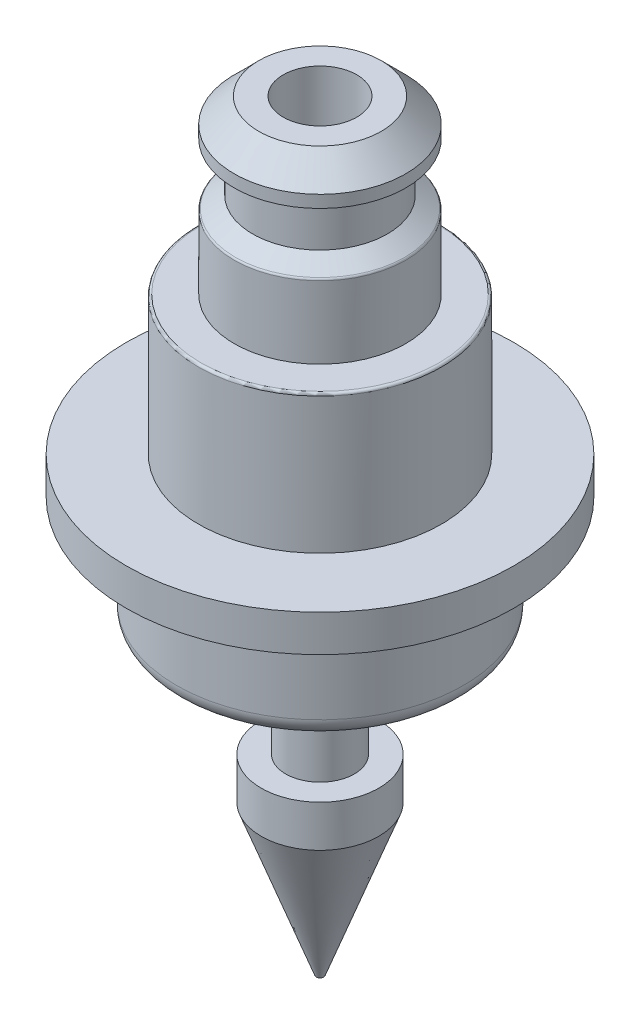
ISO-10303-21;
HEADER;
FILE_DESCRIPTION(('STEP AP214'),'2;1');
FILE_NAME('part.step','',(''),(''),'','','');
FILE_SCHEMA(('AUTOMOTIVE_DESIGN { 1 0 10303 214 1 1 1 1 }'));
ENDSEC;
DATA;
#1=APPLICATION_CONTEXT('core data for automotive mechanical design processes');
#2=APPLICATION_PROTOCOL_DEFINITION('international standard','automotive_design',2000,#1);
#3=PRODUCT_CONTEXT('',#1,'mechanical');
#4=PRODUCT('Part','Part','',(#3));
#5=PRODUCT_RELATED_PRODUCT_CATEGORY('part','',(#4));
#6=PRODUCT_DEFINITION_FORMATION('','',#4);
#7=PRODUCT_DEFINITION_CONTEXT('part definition',#1,'design');
#8=PRODUCT_DEFINITION('design','',#6,#7);
#9=PRODUCT_DEFINITION_SHAPE('','',#8);
#10=(LENGTH_UNIT() NAMED_UNIT(*) SI_UNIT(.MILLI.,.METRE.));
#11=(NAMED_UNIT(*) PLANE_ANGLE_UNIT() SI_UNIT($,.RADIAN.));
#12=(NAMED_UNIT(*) SI_UNIT($,.STERADIAN.) SOLID_ANGLE_UNIT());
#13=UNCERTAINTY_MEASURE_WITH_UNIT(LENGTH_MEASURE(1.E-05),#10,'distance_accuracy_value','');
#14=(GEOMETRIC_REPRESENTATION_CONTEXT(3) GLOBAL_UNCERTAINTY_ASSIGNED_CONTEXT((#13)) GLOBAL_UNIT_ASSIGNED_CONTEXT((#10,
#11,#12)) REPRESENTATION_CONTEXT('',''));
#15=CARTESIAN_POINT('',(0.,0.,0.));
#16=DIRECTION('',(0.,0.,1.));
#17=DIRECTION('',(1.,0.,0.));
#18=AXIS2_PLACEMENT_3D('',#15,#16,#17);
#19=CARTESIAN_POINT('',(0.,0.,0.));
#20=DIRECTION('',(0.,-1.,0.));
#21=DIRECTION('',(0.,0.,-1.));
#22=AXIS2_PLACEMENT_3D('',#19,#20,#21);
#23=CYLINDRICAL_SURFACE('',#22,1.5);
#24=CARTESIAN_POINT('',(0.,0.,0.));
#25=DIRECTION('',(0.,-1.,0.));
#26=DIRECTION('',(0.,0.,-1.));
#27=AXIS2_PLACEMENT_3D('',#24,#25,#26);
#28=CIRCLE('',#27,1.5);
#29=CARTESIAN_POINT('',(0.,0.,-1.5));
#30=VERTEX_POINT('',#29);
#31=EDGE_CURVE('E112',#30,#30,#28,.T.);
#32=ORIENTED_EDGE('',*,*,#31,.T.);
#33=EDGE_LOOP('',(#32));
#34=FACE_BOUND('',#33,.T.);
#35=CARTESIAN_POINT('',(0.,14.15,0.));
#36=DIRECTION('',(0.,-1.,0.));
#37=DIRECTION('',(0.,0.,-1.));
#38=AXIS2_PLACEMENT_3D('',#35,#36,#37);
#39=CIRCLE('',#38,1.5);
#40=CARTESIAN_POINT('',(0.,14.15,-1.5));
#41=VERTEX_POINT('',#40);
#42=EDGE_CURVE('E61',#41,#41,#39,.T.);
#43=ORIENTED_EDGE('',*,*,#42,.F.);
#44=EDGE_LOOP('',(#43));
#45=FACE_BOUND('',#44,.T.);
#46=ADVANCED_FACE('F35',(#34,#45),#23,.F.);
#47=CARTESIAN_POINT('',(1.5,14.15,0.));
#48=DIRECTION('',(0.,1.,0.));
#49=DIRECTION('',(0.,0.,1.));
#50=AXIS2_PLACEMENT_3D('',#47,#48,#49);
#51=PLANE('',#50);
#52=ORIENTED_EDGE('',*,*,#42,.T.);
#53=EDGE_LOOP('',(#52));
#54=FACE_BOUND('',#53,.T.);
#55=CARTESIAN_POINT('',(0.,14.15,0.));
#56=DIRECTION('',(0.,-1.,0.));
#57=DIRECTION('',(0.,0.,-1.));
#58=AXIS2_PLACEMENT_3D('',#55,#56,#57);
#59=CIRCLE('',#58,2.5);
#60=CARTESIAN_POINT('',(0.,14.15,-2.5));
#61=VERTEX_POINT('',#60);
#62=EDGE_CURVE('E64',#61,#61,#59,.T.);
#63=ORIENTED_EDGE('',*,*,#62,.F.);
#64=EDGE_LOOP('',(#63));
#65=FACE_BOUND('',#64,.T.);
#66=ADVANCED_FACE('F135',(#54,#65),#51,.T.);
#67=CARTESIAN_POINT('',(0.,13.15,0.));
#68=DIRECTION('',(0.,-1.,0.));
#69=DIRECTION('',(0.,0.,-1.));
#70=AXIS2_PLACEMENT_3D('',#67,#68,#69);
#71=CONICAL_SURFACE('',#70,3.5,0.785398163397448);
#72=ORIENTED_EDGE('',*,*,#62,.T.);
#73=EDGE_LOOP('',(#72));
#74=FACE_BOUND('',#73,.T.);
#75=CARTESIAN_POINT('',(0.,13.15,0.));
#76=DIRECTION('',(0.,-1.,0.));
#77=DIRECTION('',(0.,0.,-1.));
#78=AXIS2_PLACEMENT_3D('',#75,#76,#77);
#79=CIRCLE('',#78,3.5);
#80=CARTESIAN_POINT('',(0.,13.15,-3.5));
#81=VERTEX_POINT('',#80);
#82=EDGE_CURVE('E67',#81,#81,#79,.T.);
#83=ORIENTED_EDGE('',*,*,#82,.F.);
#84=EDGE_LOOP('',(#83));
#85=FACE_BOUND('',#84,.T.);
#86=ADVANCED_FACE('F140',(#74,#85),#71,.T.);
#87=CARTESIAN_POINT('',(0.,0.,0.));
#88=DIRECTION('',(0.,-1.,0.));
#89=DIRECTION('',(0.,0.,-1.));
#90=AXIS2_PLACEMENT_3D('',#87,#88,#89);
#91=CYLINDRICAL_SURFACE('',#90,3.5);
#92=ORIENTED_EDGE('',*,*,#82,.T.);
#93=EDGE_LOOP('',(#92));
#94=FACE_BOUND('',#93,.T.);
#95=CARTESIAN_POINT('',(0.,12.65,0.));
#96=DIRECTION('',(0.,-1.,0.));
#97=DIRECTION('',(0.,0.,-1.));
#98=AXIS2_PLACEMENT_3D('',#95,#96,#97);
#99=CIRCLE('',#98,3.5);
#100=CARTESIAN_POINT('',(0.,12.65,-3.5));
#101=VERTEX_POINT('',#100);
#102=EDGE_CURVE('E70',#101,#101,#99,.T.);
#103=ORIENTED_EDGE('',*,*,#102,.F.);
#104=EDGE_LOOP('',(#103));
#105=FACE_BOUND('',#104,.T.);
#106=ADVANCED_FACE('F182',(#94,#105),#91,.T.);
#107=CARTESIAN_POINT('',(0.,12.15,0.));
#108=DIRECTION('',(0.,1.,0.));
#109=DIRECTION('',(0.,0.,1.));
#110=AXIS2_PLACEMENT_3D('',#107,#108,#109);
#111=CONICAL_SURFACE('',#110,2.75,0.982793723247329);
#112=ORIENTED_EDGE('',*,*,#102,.T.);
#113=EDGE_LOOP('',(#112));
#114=FACE_BOUND('',#113,.T.);
#115=CARTESIAN_POINT('',(0.,12.15,0.));
#116=DIRECTION('',(0.,-1.,0.));
#117=DIRECTION('',(0.,0.,-1.));
#118=AXIS2_PLACEMENT_3D('',#115,#116,#117);
#119=CIRCLE('',#118,2.75);
#120=CARTESIAN_POINT('',(0.,12.15,-2.75));
#121=VERTEX_POINT('',#120);
#122=EDGE_CURVE('E73',#121,#121,#119,.T.);
#123=ORIENTED_EDGE('',*,*,#122,.F.);
#124=EDGE_LOOP('',(#123));
#125=FACE_BOUND('',#124,.T.);
#126=ADVANCED_FACE('F178',(#114,#125),#111,.T.);
#127=CARTESIAN_POINT('',(0.,0.,0.));
#128=DIRECTION('',(0.,-1.,0.));
#129=DIRECTION('',(0.,0.,-1.));
#130=AXIS2_PLACEMENT_3D('',#127,#128,#129);
#131=CYLINDRICAL_SURFACE('',#130,2.75);
#132=ORIENTED_EDGE('',*,*,#122,.T.);
#133=EDGE_LOOP('',(#132));
#134=FACE_BOUND('',#133,.T.);
#135=CARTESIAN_POINT('',(0.,10.65,0.));
#136=DIRECTION('',(0.,-1.,0.));
#137=DIRECTION('',(0.,0.,-1.));
#138=AXIS2_PLACEMENT_3D('',#135,#136,#137);
#139=CIRCLE('',#138,2.75);
#140=CARTESIAN_POINT('',(0.,10.65,-2.75));
#141=VERTEX_POINT('',#140);
#142=EDGE_CURVE('E76',#141,#141,#139,.T.);
#143=ORIENTED_EDGE('',*,*,#142,.F.);
#144=EDGE_LOOP('',(#143));
#145=FACE_BOUND('',#144,.T.);
#146=ADVANCED_FACE('F174',(#134,#145),#131,.T.);
#147=CARTESIAN_POINT('',(0.,10.15,0.));
#148=DIRECTION('',(0.,-1.,0.));
#149=DIRECTION('',(0.,0.,-1.));
#150=AXIS2_PLACEMENT_3D('',#147,#148,#149);
#151=CONICAL_SURFACE('',#150,3.5,0.982793723247328);
#152=CARTESIAN_POINT('',(0.,10.179686653585,0.));
#153=DIRECTION('',(0.,1.,0.));
#154=DIRECTION('',(0.,0.,1.));
#155=AXIS2_PLACEMENT_3D('',#152,#153,#154);
#156=CIRCLE('',#155,3.45547001962252);
#157=CARTESIAN_POINT('',(0.,10.179686653585,3.45547001962252));
#158=VERTEX_POINT('',#157);
#159=EDGE_CURVE('E46',#158,#158,#156,.T.);
#160=ORIENTED_EDGE('',*,*,#159,.T.);
#161=EDGE_LOOP('',(#160));
#162=FACE_BOUND('',#161,.T.);
#163=ORIENTED_EDGE('',*,*,#142,.T.);
#164=EDGE_LOOP('',(#163));
#165=FACE_BOUND('',#164,.T.);
#166=ADVANCED_FACE('F158',(#162,#165),#151,.T.);
#167=CARTESIAN_POINT('',(0.,0.,0.));
#168=DIRECTION('',(0.,-1.,0.));
#169=DIRECTION('',(0.,0.,-1.));
#170=AXIS2_PLACEMENT_3D('',#167,#168,#169);
#171=CYLINDRICAL_SURFACE('',#170,3.5);
#172=CARTESIAN_POINT('',(0.,10.0964816241512,0.));
#173=DIRECTION('',(0.,1.,0.));
#174=DIRECTION('',(0.,0.,1.));
#175=AXIS2_PLACEMENT_3D('',#172,#173,#174);
#176=CIRCLE('',#175,3.5);
#177=CARTESIAN_POINT('',(0.,10.0964816241512,3.5));
#178=VERTEX_POINT('',#177);
#179=EDGE_CURVE('E50',#178,#178,#176,.F.);
#180=ORIENTED_EDGE('',*,*,#179,.T.);
#181=EDGE_LOOP('',(#180));
#182=FACE_BOUND('',#181,.T.);
#183=CARTESIAN_POINT('',(0.,7.15,0.));
#184=DIRECTION('',(0.,-1.,0.));
#185=DIRECTION('',(0.,0.,-1.));
#186=AXIS2_PLACEMENT_3D('',#183,#184,#185);
#187=CIRCLE('',#186,3.5);
#188=CARTESIAN_POINT('',(0.,7.15,-3.5));
#189=VERTEX_POINT('',#188);
#190=EDGE_CURVE('E79',#189,#189,#187,.T.);
#191=ORIENTED_EDGE('',*,*,#190,.F.);
#192=EDGE_LOOP('',(#191));
#193=FACE_BOUND('',#192,.T.);
#194=ADVANCED_FACE('F154',(#182,#193),#171,.T.);
#195=CARTESIAN_POINT('',(3.5,7.15,0.));
#196=DIRECTION('',(0.,1.,0.));
#197=DIRECTION('',(0.,0.,1.));
#198=AXIS2_PLACEMENT_3D('',#195,#196,#197);
#199=PLANE('',#198);
#200=CARTESIAN_POINT('',(0.,7.15,0.));
#201=DIRECTION('',(0.,1.,0.));
#202=DIRECTION('',(0.,0.,1.));
#203=AXIS2_PLACEMENT_3D('',#200,#201,#202);
#204=CIRCLE('',#203,4.855);
#205=CARTESIAN_POINT('',(0.,7.15,4.855));
#206=VERTEX_POINT('',#205);
#207=EDGE_CURVE('E10',#206,#206,#204,.T.);
#208=ORIENTED_EDGE('',*,*,#207,.T.);
#209=EDGE_LOOP('',(#208));
#210=FACE_BOUND('',#209,.T.);
#211=ORIENTED_EDGE('',*,*,#190,.T.);
#212=EDGE_LOOP('',(#211));
#213=FACE_BOUND('',#212,.T.);
#214=ADVANCED_FACE('F157',(#210,#213),#199,.T.);
#215=CARTESIAN_POINT('',(0.,0.,0.));
#216=DIRECTION('',(0.,-1.,0.));
#217=DIRECTION('',(0.,0.,-1.));
#218=AXIS2_PLACEMENT_3D('',#215,#216,#217);
#219=CYLINDRICAL_SURFACE('',#218,4.955);
#220=CARTESIAN_POINT('',(0.,7.05,0.));
#221=DIRECTION('',(0.,1.,0.));
#222=DIRECTION('',(0.,0.,1.));
#223=AXIS2_PLACEMENT_3D('',#220,#221,#222);
#224=CIRCLE('',#223,4.955);
#225=CARTESIAN_POINT('',(0.,7.05,4.955));
#226=VERTEX_POINT('',#225);
#227=EDGE_CURVE('E42',#226,#226,#224,.F.);
#228=ORIENTED_EDGE('',*,*,#227,.T.);
#229=EDGE_LOOP('',(#228));
#230=FACE_BOUND('',#229,.T.);
#231=CARTESIAN_POINT('',(0.,1.5,0.));
#232=DIRECTION('',(0.,-1.,0.));
#233=DIRECTION('',(0.,0.,-1.));
#234=AXIS2_PLACEMENT_3D('',#231,#232,#233);
#235=CIRCLE('',#234,4.955);
#236=CARTESIAN_POINT('',(0.,1.5,-4.955));
#237=VERTEX_POINT('',#236);
#238=EDGE_CURVE('E82',#237,#237,#235,.T.);
#239=ORIENTED_EDGE('',*,*,#238,.F.);
#240=EDGE_LOOP('',(#239));
#241=FACE_BOUND('',#240,.T.);
#242=ADVANCED_FACE('F163',(#230,#241),#219,.T.);
#243=CARTESIAN_POINT('',(4.955,1.5,0.));
#244=DIRECTION('',(0.,1.,0.));
#245=DIRECTION('',(0.,0.,1.));
#246=AXIS2_PLACEMENT_3D('',#243,#244,#245);
#247=PLANE('',#246);
#248=ORIENTED_EDGE('',*,*,#238,.T.);
#249=EDGE_LOOP('',(#248));
#250=FACE_BOUND('',#249,.T.);
#251=CARTESIAN_POINT('',(0.,1.5,0.));
#252=DIRECTION('',(0.,-1.,0.));
#253=DIRECTION('',(0.,0.,-1.));
#254=AXIS2_PLACEMENT_3D('',#251,#252,#253);
#255=CIRCLE('',#254,7.9);
#256=CARTESIAN_POINT('',(0.,1.5,-7.9));
#257=VERTEX_POINT('',#256);
#258=EDGE_CURVE('E85',#257,#257,#255,.T.);
#259=ORIENTED_EDGE('',*,*,#258,.F.);
#260=EDGE_LOOP('',(#259));
#261=FACE_BOUND('',#260,.T.);
#262=ADVANCED_FACE('F168',(#250,#261),#247,.T.);
#263=CARTESIAN_POINT('',(0.,0.,0.));
#264=DIRECTION('',(0.,-1.,0.));
#265=DIRECTION('',(0.,0.,-1.));
#266=AXIS2_PLACEMENT_3D('',#263,#264,#265);
#267=CYLINDRICAL_SURFACE('',#266,7.9);
#268=ORIENTED_EDGE('',*,*,#258,.T.);
#269=EDGE_LOOP('',(#268));
#270=FACE_BOUND('',#269,.T.);
#271=CARTESIAN_POINT('',(0.,0.,0.));
#272=DIRECTION('',(0.,-1.,0.));
#273=DIRECTION('',(0.,0.,-1.));
#274=AXIS2_PLACEMENT_3D('',#271,#272,#273);
#275=CIRCLE('',#274,7.9);
#276=CARTESIAN_POINT('',(0.,0.,-7.9));
#277=VERTEX_POINT('',#276);
#278=EDGE_CURVE('E88',#277,#277,#275,.T.);
#279=ORIENTED_EDGE('',*,*,#278,.F.);
#280=EDGE_LOOP('',(#279));
#281=FACE_BOUND('',#280,.T.);
#282=ADVANCED_FACE('F330',(#270,#281),#267,.T.);
#283=CARTESIAN_POINT('',(7.9,0.,0.));
#284=DIRECTION('',(0.,-1.,0.));
#285=DIRECTION('',(0.,0.,-1.));
#286=AXIS2_PLACEMENT_3D('',#283,#284,#285);
#287=PLANE('',#286);
#288=ORIENTED_EDGE('',*,*,#278,.T.);
#289=EDGE_LOOP('',(#288));
#290=FACE_BOUND('',#289,.T.);
#291=CARTESIAN_POINT('',(0.,0.,0.));
#292=DIRECTION('',(0.,-1.,0.));
#293=DIRECTION('',(0.,0.,-1.));
#294=AXIS2_PLACEMENT_3D('',#291,#292,#293);
#295=CIRCLE('',#294,5.85);
#296=CARTESIAN_POINT('',(0.,0.,-5.85));
#297=VERTEX_POINT('',#296);
#298=EDGE_CURVE('E91',#297,#297,#295,.T.);
#299=ORIENTED_EDGE('',*,*,#298,.F.);
#300=EDGE_LOOP('',(#299));
#301=FACE_BOUND('',#300,.T.);
#302=ADVANCED_FACE('F321',(#290,#301),#287,.T.);
#303=CARTESIAN_POINT('',(0.,0.,0.));
#304=DIRECTION('',(0.,-1.,0.));
#305=DIRECTION('',(0.,0.,-1.));
#306=AXIS2_PLACEMENT_3D('',#303,#304,#305);
#307=CYLINDRICAL_SURFACE('',#306,5.85);
#308=CARTESIAN_POINT('',(0.,-3.75,0.));
#309=DIRECTION('',(0.,-1.,0.));
#310=DIRECTION('',(0.,0.,-1.));
#311=AXIS2_PLACEMENT_3D('',#308,#309,#310);
#312=CIRCLE('',#311,5.85);
#313=CARTESIAN_POINT('',(0.,-3.75,-5.85));
#314=VERTEX_POINT('',#313);
#315=EDGE_CURVE('E55',#314,#314,#312,.F.);
#316=ORIENTED_EDGE('',*,*,#315,.T.);
#317=EDGE_LOOP('',(#316));
#318=FACE_BOUND('',#317,.T.);
#319=ORIENTED_EDGE('',*,*,#298,.T.);
#320=EDGE_LOOP('',(#319));
#321=FACE_BOUND('',#320,.T.);
#322=ADVANCED_FACE('F312',(#318,#321),#307,.T.);
#323=CARTESIAN_POINT('',(5.85,-4.5,0.));
#324=DIRECTION('',(0.,-1.,0.));
#325=DIRECTION('',(0.,0.,-1.));
#326=AXIS2_PLACEMENT_3D('',#323,#324,#325);
#327=PLANE('',#326);
#328=CARTESIAN_POINT('',(0.,-4.5,0.));
#329=DIRECTION('',(0.,-1.,0.));
#330=DIRECTION('',(0.,0.,-1.));
#331=AXIS2_PLACEMENT_3D('',#328,#329,#330);
#332=CIRCLE('',#331,5.1);
#333=CARTESIAN_POINT('',(0.,-4.5,-5.1));
#334=VERTEX_POINT('',#333);
#335=EDGE_CURVE('E58',#334,#334,#332,.T.);
#336=ORIENTED_EDGE('',*,*,#335,.T.);
#337=EDGE_LOOP('',(#336));
#338=FACE_BOUND('',#337,.T.);
#339=CARTESIAN_POINT('',(0.,-4.5,0.));
#340=DIRECTION('',(0.,-1.,0.));
#341=DIRECTION('',(0.,0.,-1.));
#342=AXIS2_PLACEMENT_3D('',#339,#340,#341);
#343=CIRCLE('',#342,1.4);
#344=CARTESIAN_POINT('',(0.,-4.5,-1.4));
#345=VERTEX_POINT('',#344);
#346=EDGE_CURVE('E94',#345,#345,#343,.T.);
#347=ORIENTED_EDGE('',*,*,#346,.F.);
#348=EDGE_LOOP('',(#347));
#349=FACE_BOUND('',#348,.T.);
#350=ADVANCED_FACE('F303',(#338,#349),#327,.T.);
#351=CARTESIAN_POINT('',(0.,0.,0.));
#352=DIRECTION('',(0.,-1.,0.));
#353=DIRECTION('',(0.,0.,-1.));
#354=AXIS2_PLACEMENT_3D('',#351,#352,#353);
#355=CYLINDRICAL_SURFACE('',#354,1.4);
#356=ORIENTED_EDGE('',*,*,#346,.T.);
#357=EDGE_LOOP('',(#356));
#358=FACE_BOUND('',#357,.T.);
#359=CARTESIAN_POINT('',(0.,-9.1,0.));
#360=DIRECTION('',(0.,-1.,0.));
#361=DIRECTION('',(0.,0.,-1.));
#362=AXIS2_PLACEMENT_3D('',#359,#360,#361);
#363=CIRCLE('',#362,1.4);
#364=CARTESIAN_POINT('',(0.,-9.1,-1.4));
#365=VERTEX_POINT('',#364);
#366=EDGE_CURVE('E97',#365,#365,#363,.T.);
#367=ORIENTED_EDGE('',*,*,#366,.F.);
#368=EDGE_LOOP('',(#367));
#369=FACE_BOUND('',#368,.T.);
#370=ADVANCED_FACE('F293',(#358,#369),#355,.T.);
#371=CARTESIAN_POINT('',(1.4,-9.1,0.));
#372=DIRECTION('',(0.,1.,0.));
#373=DIRECTION('',(0.,0.,1.));
#374=AXIS2_PLACEMENT_3D('',#371,#372,#373);
#375=PLANE('',#374);
#376=ORIENTED_EDGE('',*,*,#366,.T.);
#377=EDGE_LOOP('',(#376));
#378=FACE_BOUND('',#377,.T.);
#379=CARTESIAN_POINT('',(0.,-9.1,0.));
#380=DIRECTION('',(0.,-1.,0.));
#381=DIRECTION('',(0.,0.,-1.));
#382=AXIS2_PLACEMENT_3D('',#379,#380,#381);
#383=CIRCLE('',#382,2.4);
#384=CARTESIAN_POINT('',(0.,-9.1,-2.4));
#385=VERTEX_POINT('',#384);
#386=EDGE_CURVE('E100',#385,#385,#383,.T.);
#387=ORIENTED_EDGE('',*,*,#386,.F.);
#388=EDGE_LOOP('',(#387));
#389=FACE_BOUND('',#388,.T.);
#390=ADVANCED_FACE('F283',(#378,#389),#375,.T.);
#391=CARTESIAN_POINT('',(0.,0.,0.));
#392=DIRECTION('',(0.,-1.,0.));
#393=DIRECTION('',(0.,0.,-1.));
#394=AXIS2_PLACEMENT_3D('',#391,#392,#393);
#395=CYLINDRICAL_SURFACE('',#394,2.4);
#396=ORIENTED_EDGE('',*,*,#386,.T.);
#397=EDGE_LOOP('',(#396));
#398=FACE_BOUND('',#397,.T.);
#399=CARTESIAN_POINT('',(0.,-10.8,0.));
#400=DIRECTION('',(0.,-1.,0.));
#401=DIRECTION('',(0.,0.,-1.));
#402=AXIS2_PLACEMENT_3D('',#399,#400,#401);
#403=CIRCLE('',#402,2.4);
#404=CARTESIAN_POINT('',(0.,-10.8,2.4));
#405=VERTEX_POINT('',#404);
#406=EDGE_CURVE('E103',#405,#405,#403,.T.);
#407=ORIENTED_EDGE('',*,*,#406,.F.);
#408=EDGE_LOOP('',(#407));
#409=FACE_BOUND('',#408,.T.);
#410=ADVANCED_FACE('F273',(#398,#409),#395,.T.);
#411=CARTESIAN_POINT('',(0.,-16.9,0.));
#412=DIRECTION('',(0.,1.,0.));
#413=DIRECTION('',(0.,0.,1.));
#414=AXIS2_PLACEMENT_3D('',#411,#412,#413);
#415=CONICAL_SURFACE('',#414,0.15,0.353370182719398);
#416=CARTESIAN_POINT('',(0.,-16.9,0.));
#417=DIRECTION('',(0.,-1.,0.));
#418=DIRECTION('',(0.,0.,-1.));
#419=AXIS2_PLACEMENT_3D('',#416,#417,#418);
#420=CIRCLE('',#419,0.15);
#421=CARTESIAN_POINT('',(0.,-16.9,0.150000000000001));
#422=VERTEX_POINT('',#421);
#423=EDGE_CURVE('E106',#422,#422,#420,.T.);
#424=CARTESIAN_POINT('',(0.,-10.8,2.4));
#425=CARTESIAN_POINT('',(0.,-10.8635416666667,2.3765625));
#426=CARTESIAN_POINT('',(0.,-10.9270833333333,2.353125));
#427=CARTESIAN_POINT('',(0.,-11.0541666666667,2.30625));
#428=CARTESIAN_POINT('',(0.,-11.1177083333333,2.2828125));
#429=CARTESIAN_POINT('',(0.,-11.2447916666667,2.2359375));
#430=CARTESIAN_POINT('',(0.,-11.3083333333333,2.2125));
#431=CARTESIAN_POINT('',(0.,-11.4354166666667,2.165625));
#432=CARTESIAN_POINT('',(0.,-11.4989583333333,2.1421875));
#433=CARTESIAN_POINT('',(0.,-11.6260416666667,2.0953125));
#434=CARTESIAN_POINT('',(0.,-11.6895833333333,2.071875));
#435=CARTESIAN_POINT('',(0.,-11.8166666666667,2.025));
#436=CARTESIAN_POINT('',(0.,-11.8802083333333,2.0015625));
#437=CARTESIAN_POINT('',(0.,-12.0072916666667,1.9546875));
#438=CARTESIAN_POINT('',(0.,-12.0708333333333,1.93125));
#439=CARTESIAN_POINT('',(0.,-12.1979166666667,1.884375));
#440=CARTESIAN_POINT('',(0.,-12.2614583333333,1.8609375));
#441=CARTESIAN_POINT('',(0.,-12.3885416666667,1.8140625));
#442=CARTESIAN_POINT('',(0.,-12.4520833333333,1.790625));
#443=CARTESIAN_POINT('',(0.,-12.5791666666667,1.74375));
#444=CARTESIAN_POINT('',(0.,-12.6427083333333,1.7203125));
#445=CARTESIAN_POINT('',(0.,-12.7697916666667,1.6734375));
#446=CARTESIAN_POINT('',(0.,-12.8333333333333,1.65));
#447=CARTESIAN_POINT('',(0.,-12.9604166666667,1.603125));
#448=CARTESIAN_POINT('',(0.,-13.0239583333333,1.5796875));
#449=CARTESIAN_POINT('',(0.,-13.1510416666667,1.5328125));
#450=CARTESIAN_POINT('',(0.,-13.2145833333333,1.509375));
#451=CARTESIAN_POINT('',(0.,-13.3416666666667,1.4625));
#452=CARTESIAN_POINT('',(0.,-13.4052083333333,1.4390625));
#453=CARTESIAN_POINT('',(0.,-13.5322916666667,1.3921875));
#454=CARTESIAN_POINT('',(0.,-13.5958333333333,1.36875));
#455=CARTESIAN_POINT('',(0.,-13.7229166666667,1.321875));
#456=CARTESIAN_POINT('',(0.,-13.7864583333333,1.2984375));
#457=CARTESIAN_POINT('',(0.,-13.9135416666667,1.2515625));
#458=CARTESIAN_POINT('',(0.,-13.9770833333333,1.228125));
#459=CARTESIAN_POINT('',(0.,-14.1041666666667,1.18125));
#460=CARTESIAN_POINT('',(0.,-14.1677083333333,1.1578125));
#461=CARTESIAN_POINT('',(0.,-14.2947916666667,1.1109375));
#462=CARTESIAN_POINT('',(0.,-14.3583333333333,1.0875));
#463=CARTESIAN_POINT('',(0.,-14.4854166666667,1.040625));
#464=CARTESIAN_POINT('',(0.,-14.5489583333333,1.0171875));
#465=CARTESIAN_POINT('',(0.,-14.6760416666667,0.9703125));
#466=CARTESIAN_POINT('',(0.,-14.7395833333333,0.946875));
#467=CARTESIAN_POINT('',(0.,-14.8666666666667,0.9));
#468=CARTESIAN_POINT('',(0.,-14.9302083333333,0.8765625));
#469=CARTESIAN_POINT('',(0.,-15.0572916666667,0.8296875));
#470=CARTESIAN_POINT('',(0.,-15.1208333333333,0.80625));
#471=CARTESIAN_POINT('',(0.,-15.2479166666667,0.759375));
#472=CARTESIAN_POINT('',(0.,-15.3114583333333,0.7359375));
#473=CARTESIAN_POINT('',(0.,-15.4385416666667,0.6890625));
#474=CARTESIAN_POINT('',(0.,-15.5020833333333,0.665625));
#475=CARTESIAN_POINT('',(0.,-15.6291666666667,0.61875));
#476=CARTESIAN_POINT('',(0.,-15.6927083333333,0.595312500000001));
#477=CARTESIAN_POINT('',(0.,-15.8197916666667,0.548437500000001));
#478=CARTESIAN_POINT('',(0.,-15.8833333333333,0.525));
#479=CARTESIAN_POINT('',(0.,-16.0104166666667,0.478125));
#480=CARTESIAN_POINT('',(0.,-16.0739583333333,0.454687500000001));
#481=CARTESIAN_POINT('',(0.,-16.2010416666667,0.407812500000001));
#482=CARTESIAN_POINT('',(0.,-16.2645833333333,0.384375));
#483=CARTESIAN_POINT('',(0.,-16.3916666666667,0.3375));
#484=CARTESIAN_POINT('',(0.,-16.4552083333333,0.3140625));
#485=CARTESIAN_POINT('',(0.,-16.5822916666667,0.267187500000001));
#486=CARTESIAN_POINT('',(0.,-16.6458333333333,0.24375));
#487=CARTESIAN_POINT('',(0.,-16.7729166666667,0.196875000000001));
#488=CARTESIAN_POINT('',(0.,-16.8364583333333,0.173437500000001));
#489=CARTESIAN_POINT('',(0.,-16.9,0.150000000000001));
#490=B_SPLINE_CURVE_WITH_KNOTS('',3,(#424,#425,#426,#427,#428,#429,#430,#431,#432,#433,#434,
#435,#436,#437,#438,#439,#440,#441,#442,#443,#444,#445,#446,#447,#448,#449,#450,#451,#452,#453,
#454,#455,#456,#457,#458,#459,#460,#461,#462,#463,#464,#465,#466,#467,#468,#469,#470,#471,#472,
#473,#474,#475,#476,#477,#478,#479,#480,#481,#482,#483,#484,#485,#486,#487,#488,#489),
.UNSPECIFIED.,.F.,.F.,(4,2,2,2,2,2,2,2,2,2,2,2,2,2,2,2,2,2,2,2,2,2,2,2,2,2,2,2,2,2,2,2,4),(0.,
0.203179079339507,0.406358158679015,0.609537238018523,0.81271631735803,1.01589539669754,
1.21907447603705,1.42225355537655,1.62543263471606,1.82861171405557,2.03179079339508,
2.23496987273459,2.43814895207409,2.6413280314136,2.84450711075311,3.04768619009262,
3.25086526943212,3.45404434877163,3.65722342811114,3.86040250745065,4.06358158679015,
4.26676066612966,4.46993974546917,4.67311882480868,4.87629790414818,5.07947698348769,
5.2826560628272,5.48583514216671,5.68901422150622,5.89219330084573,6.09537238018523,
6.29855145952474,6.50173053886425),.UNSPECIFIED.);
#491=EDGE_CURVE('BSEAM131',#405,#422,#490,.T.);
#492=ORIENTED_EDGE('',*,*,#406,.T.);
#493=ORIENTED_EDGE('',*,*,#423,.F.);
#494=ORIENTED_EDGE('',*,*,#491,.T.);
#495=ORIENTED_EDGE('',*,*,#491,.F.);
#496=EDGE_LOOP('',(#492,#494,#493,#495));
#497=FACE_BOUND('',#496,.T.);
#498=ADVANCED_FACE('F131',(#497),#415,.T.);
#499=CARTESIAN_POINT('',(0.,0.,0.));
#500=DIRECTION('',(0.,-1.,0.));
#501=DIRECTION('',(0.,0.,-1.));
#502=AXIS2_PLACEMENT_3D('',#499,#500,#501);
#503=CYLINDRICAL_SURFACE('',#502,0.15);
#504=ORIENTED_EDGE('',*,*,#423,.T.);
#505=EDGE_LOOP('',(#504));
#506=FACE_BOUND('',#505,.T.);
#507=CARTESIAN_POINT('',(0.,0.,0.));
#508=DIRECTION('',(0.,-1.,0.));
#509=DIRECTION('',(0.,0.,-1.));
#510=AXIS2_PLACEMENT_3D('',#507,#508,#509);
#511=CIRCLE('',#510,0.15);
#512=CARTESIAN_POINT('',(0.,0.,-0.15));
#513=VERTEX_POINT('',#512);
#514=EDGE_CURVE('E109',#513,#513,#511,.T.);
#515=ORIENTED_EDGE('',*,*,#514,.F.);
#516=EDGE_LOOP('',(#515));
#517=FACE_BOUND('',#516,.T.);
#518=ADVANCED_FACE('F121',(#506,#517),#503,.F.);
#519=CARTESIAN_POINT('',(0.15,0.,0.));
#520=DIRECTION('',(0.,1.,0.));
#521=DIRECTION('',(0.,0.,1.));
#522=AXIS2_PLACEMENT_3D('',#519,#520,#521);
#523=PLANE('',#522);
#524=ORIENTED_EDGE('',*,*,#514,.T.);
#525=EDGE_LOOP('',(#524));
#526=FACE_BOUND('',#525,.T.);
#527=ORIENTED_EDGE('',*,*,#31,.F.);
#528=EDGE_LOOP('',(#527));
#529=FACE_BOUND('',#528,.T.);
#530=ADVANCED_FACE('F118',(#526,#529),#523,.T.);
#531=CARTESIAN_POINT('',(0.,-3.75,0.));
#532=DIRECTION('',(0.,-1.,0.));
#533=DIRECTION('',(0.,0.,-1.));
#534=AXIS2_PLACEMENT_3D('',#531,#532,#533);
#535=TOROIDAL_SURFACE('',#534,5.1,0.75);
#536=ORIENTED_EDGE('',*,*,#315,.F.);
#537=EDGE_LOOP('',(#536));
#538=FACE_BOUND('',#537,.T.);
#539=ORIENTED_EDGE('',*,*,#335,.F.);
#540=EDGE_LOOP('',(#539));
#541=FACE_BOUND('',#540,.T.);
#542=ADVANCED_FACE('F120',(#538,#541),#535,.T.);
#543=CARTESIAN_POINT('',(0.,10.0964816241512,0.));
#544=DIRECTION('',(0.,1.,0.));
#545=DIRECTION('',(0.,0.,1.));
#546=AXIS2_PLACEMENT_3D('',#543,#544,#545);
#547=TOROIDAL_SURFACE('',#546,3.4,0.1);
#548=ORIENTED_EDGE('',*,*,#159,.F.);
#549=EDGE_LOOP('',(#548));
#550=FACE_BOUND('',#549,.T.);
#551=ORIENTED_EDGE('',*,*,#179,.F.);
#552=EDGE_LOOP('',(#551));
#553=FACE_BOUND('',#552,.T.);
#554=ADVANCED_FACE('F128',(#550,#553),#547,.T.);
#555=CARTESIAN_POINT('',(0.,7.05,0.));
#556=DIRECTION('',(0.,1.,0.));
#557=DIRECTION('',(0.,0.,1.));
#558=AXIS2_PLACEMENT_3D('',#555,#556,#557);
#559=TOROIDAL_SURFACE('',#558,4.855,0.1);
#560=ORIENTED_EDGE('',*,*,#207,.F.);
#561=EDGE_LOOP('',(#560));
#562=FACE_BOUND('',#561,.T.);
#563=ORIENTED_EDGE('',*,*,#227,.F.);
#564=EDGE_LOOP('',(#563));
#565=FACE_BOUND('',#564,.T.);
#566=ADVANCED_FACE('F37',(#562,#565),#559,.T.);
#567=CLOSED_SHELL('',(#46,#66,#86,#106,#126,#146,#166,#194,#214,#242,#262,#282,#302,#322,#350,
#370,#390,#410,#498,#518,#530,#542,#554,#566));
#568=MANIFOLD_SOLID_BREP('B2',#567);
#569=ADVANCED_BREP_SHAPE_REPRESENTATION('',(#18,#568),#14);
#570=SHAPE_DEFINITION_REPRESENTATION(#9,#569);
ENDSEC;
END-ISO-10303-21;
